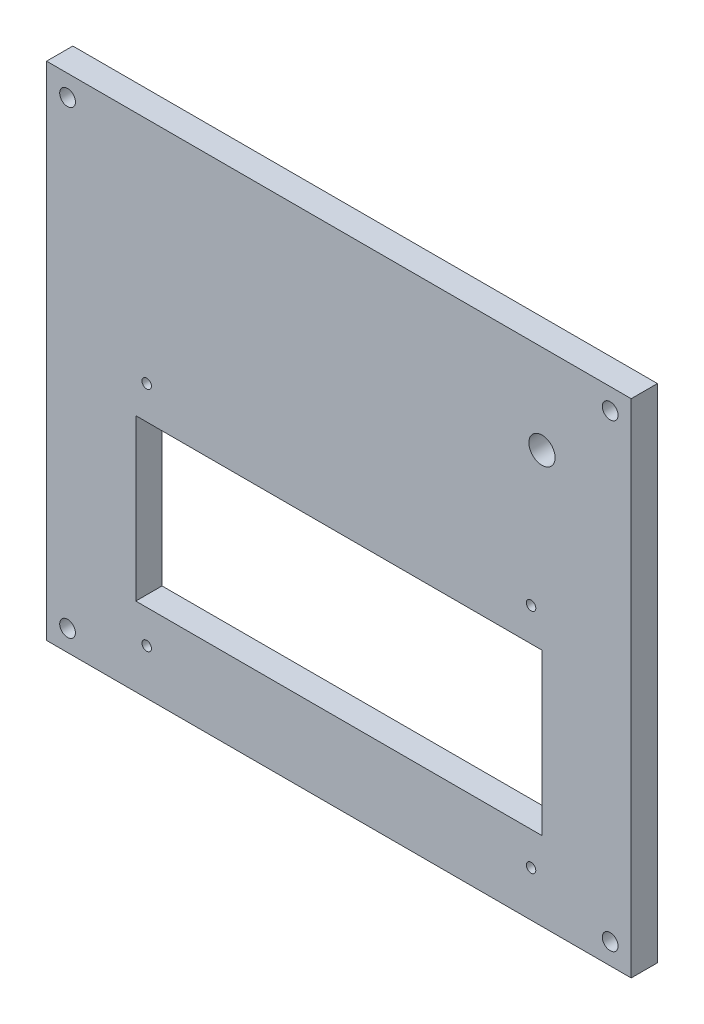
ISO-10303-21;
HEADER;
FILE_DESCRIPTION(('STEP AP214'),'2;1');
FILE_NAME('part.step','',(''),(''),'','','');
FILE_SCHEMA(('AUTOMOTIVE_DESIGN { 1 0 10303 214 1 1 1 1 }'));
ENDSEC;
DATA;
#1=APPLICATION_CONTEXT('core data for automotive mechanical design processes');
#2=APPLICATION_PROTOCOL_DEFINITION('international standard','automotive_design',2000,#1);
#3=PRODUCT_CONTEXT('',#1,'mechanical');
#4=PRODUCT('Part','Part','',(#3));
#5=PRODUCT_RELATED_PRODUCT_CATEGORY('part','',(#4));
#6=PRODUCT_DEFINITION_FORMATION('','',#4);
#7=PRODUCT_DEFINITION_CONTEXT('part definition',#1,'design');
#8=PRODUCT_DEFINITION('design','',#6,#7);
#9=PRODUCT_DEFINITION_SHAPE('','',#8);
#10=(LENGTH_UNIT() NAMED_UNIT(*) SI_UNIT(.MILLI.,.METRE.));
#11=(NAMED_UNIT(*) PLANE_ANGLE_UNIT() SI_UNIT($,.RADIAN.));
#12=(NAMED_UNIT(*) SI_UNIT($,.STERADIAN.) SOLID_ANGLE_UNIT());
#13=UNCERTAINTY_MEASURE_WITH_UNIT(LENGTH_MEASURE(1.E-05),#10,'distance_accuracy_value','');
#14=(GEOMETRIC_REPRESENTATION_CONTEXT(3) GLOBAL_UNCERTAINTY_ASSIGNED_CONTEXT((#13)) GLOBAL_UNIT_ASSIGNED_CONTEXT((#10,
#11,#12)) REPRESENTATION_CONTEXT('',''));
#15=CARTESIAN_POINT('',(0.,0.,0.));
#16=DIRECTION('',(0.,0.,1.));
#17=DIRECTION('',(1.,0.,0.));
#18=AXIS2_PLACEMENT_3D('',#15,#16,#17);
#19=CARTESIAN_POINT('',(0.,0.,6.35));
#20=DIRECTION('',(0.,0.,1.));
#21=DIRECTION('',(1.,0.,0.));
#22=AXIS2_PLACEMENT_3D('',#19,#20,#21);
#23=PLANE('',#22);
#24=CARTESIAN_POINT('',(114.808,97.282,6.35));
#25=DIRECTION('',(0.,0.,1.));
#26=DIRECTION('',(1.,0.,0.));
#27=AXIS2_PLACEMENT_3D('',#24,#25,#26);
#28=CIRCLE('',#27,1.90500000000001);
#29=CARTESIAN_POINT('',(116.713,97.282,6.35));
#30=VERTEX_POINT('',#29);
#31=EDGE_CURVE('E339',#30,#30,#28,.T.);
#32=ORIENTED_EDGE('',*,*,#31,.F.);
#33=EDGE_LOOP('',(#32));
#34=FACE_BOUND('',#33,.T.);
#35=CARTESIAN_POINT('',(114.808,-13.97,6.35));
#36=DIRECTION('',(0.,0.,1.));
#37=DIRECTION('',(1.,0.,0.));
#38=AXIS2_PLACEMENT_3D('',#35,#36,#37);
#39=CIRCLE('',#38,1.90500000000001);
#40=CARTESIAN_POINT('',(116.713,-13.97,6.35));
#41=VERTEX_POINT('',#40);
#42=EDGE_CURVE('E331',#41,#41,#39,.T.);
#43=ORIENTED_EDGE('',*,*,#42,.F.);
#44=EDGE_LOOP('',(#43));
#45=FACE_BOUND('',#44,.T.);
#46=CARTESIAN_POINT('',(-16.51,-13.97,6.35));
#47=DIRECTION('',(0.,0.,1.));
#48=DIRECTION('',(1.,0.,0.));
#49=AXIS2_PLACEMENT_3D('',#46,#47,#48);
#50=CIRCLE('',#49,1.905);
#51=CARTESIAN_POINT('',(-14.605,-13.97,6.35));
#52=VERTEX_POINT('',#51);
#53=EDGE_CURVE('E324',#52,#52,#50,.T.);
#54=ORIENTED_EDGE('',*,*,#53,.F.);
#55=EDGE_LOOP('',(#54));
#56=FACE_BOUND('',#55,.T.);
#57=CARTESIAN_POINT('',(-16.51,97.282,6.35));
#58=DIRECTION('',(0.,0.,1.));
#59=DIRECTION('',(1.,0.,0.));
#60=AXIS2_PLACEMENT_3D('',#57,#58,#59);
#61=CIRCLE('',#60,1.90500000000001);
#62=CARTESIAN_POINT('',(-14.605,97.282,6.35));
#63=VERTEX_POINT('',#62);
#64=EDGE_CURVE('E328',#63,#63,#61,.T.);
#65=ORIENTED_EDGE('',*,*,#64,.F.);
#66=EDGE_LOOP('',(#65));
#67=FACE_BOUND('',#66,.T.);
#68=CARTESIAN_POINT('',(2.6416,46.9138,6.35));
#69=DIRECTION('',(0.,0.,1.));
#70=DIRECTION('',(1.,0.,0.));
#71=AXIS2_PLACEMENT_3D('',#68,#69,#70);
#72=CIRCLE('',#71,1.143);
#73=CARTESIAN_POINT('',(3.7846,46.9138,6.35));
#74=VERTEX_POINT('',#73);
#75=EDGE_CURVE('E354',#74,#74,#72,.T.);
#76=ORIENTED_EDGE('',*,*,#75,.F.);
#77=EDGE_LOOP('',(#76));
#78=FACE_BOUND('',#77,.T.);
#79=CARTESIAN_POINT('',(95.6564,-8.0518,6.35));
#80=DIRECTION('',(0.,0.,1.));
#81=DIRECTION('',(1.,0.,0.));
#82=AXIS2_PLACEMENT_3D('',#79,#80,#81);
#83=CIRCLE('',#82,1.143);
#84=CARTESIAN_POINT('',(96.7994,-8.0518,6.35));
#85=VERTEX_POINT('',#84);
#86=EDGE_CURVE('E351',#85,#85,#83,.T.);
#87=ORIENTED_EDGE('',*,*,#86,.F.);
#88=EDGE_LOOP('',(#87));
#89=FACE_BOUND('',#88,.T.);
#90=CARTESIAN_POINT('',(2.64160000000001,-8.05179999999999,6.35));
#91=DIRECTION('',(0.,0.,1.));
#92=DIRECTION('',(1.,0.,0.));
#93=AXIS2_PLACEMENT_3D('',#90,#91,#92);
#94=CIRCLE('',#93,1.143);
#95=CARTESIAN_POINT('',(3.78460000000001,-8.05179999999999,6.35));
#96=VERTEX_POINT('',#95);
#97=EDGE_CURVE('E345',#96,#96,#94,.T.);
#98=ORIENTED_EDGE('',*,*,#97,.F.);
#99=EDGE_LOOP('',(#98));
#100=FACE_BOUND('',#99,.T.);
#101=CARTESIAN_POINT('',(95.6564,46.9138,6.35));
#102=DIRECTION('',(0.,0.,1.));
#103=DIRECTION('',(1.,0.,0.));
#104=AXIS2_PLACEMENT_3D('',#101,#102,#103);
#105=CIRCLE('',#104,1.143);
#106=CARTESIAN_POINT('',(96.7994,46.9138,6.35));
#107=VERTEX_POINT('',#106);
#108=EDGE_CURVE('E146',#107,#107,#105,.T.);
#109=ORIENTED_EDGE('',*,*,#108,.F.);
#110=EDGE_LOOP('',(#109));
#111=FACE_BOUND('',#110,.T.);
#112=DIRECTION('',(1.,0.,0.));
#113=VECTOR('',#112,1.);
#114=CARTESIAN_POINT('',(0.,0.,6.35));
#115=LINE('',#114,#113);
#116=CARTESIAN_POINT('',(0.,0.,6.35));
#117=VERTEX_POINT('',#116);
#118=CARTESIAN_POINT('',(98.298,0.,6.35));
#119=VERTEX_POINT('',#118);
#120=EDGE_CURVE('E164',#117,#119,#115,.T.);
#121=ORIENTED_EDGE('',*,*,#120,.F.);
#122=DIRECTION('',(0.,-1.,0.));
#123=VECTOR('',#122,1.);
#124=CARTESIAN_POINT('',(0.,0.,6.35));
#125=LINE('',#124,#123);
#126=CARTESIAN_POINT('',(0.,38.862,6.35));
#127=VERTEX_POINT('',#126);
#128=EDGE_CURVE('E162',#127,#117,#125,.T.);
#129=ORIENTED_EDGE('',*,*,#128,.F.);
#130=DIRECTION('',(-1.,0.,0.));
#131=VECTOR('',#130,1.);
#132=CARTESIAN_POINT('',(0.,38.862,6.35));
#133=LINE('',#132,#131);
#134=CARTESIAN_POINT('',(98.298,38.862,6.35));
#135=VERTEX_POINT('',#134);
#136=EDGE_CURVE('E169',#135,#127,#133,.T.);
#137=ORIENTED_EDGE('',*,*,#136,.F.);
#138=DIRECTION('',(0.,1.,0.));
#139=VECTOR('',#138,1.);
#140=CARTESIAN_POINT('',(98.298,0.,6.35));
#141=LINE('',#140,#139);
#142=EDGE_CURVE('E167',#119,#135,#141,.T.);
#143=ORIENTED_EDGE('',*,*,#142,.F.);
#144=EDGE_LOOP('',(#121,#129,#137,#143));
#145=FACE_BOUND('',#144,.T.);
#146=DIRECTION('',(0.,-1.,0.));
#147=VECTOR('',#146,1.);
#148=CARTESIAN_POINT('',(-21.59,102.362,6.35));
#149=LINE('',#148,#147);
#150=CARTESIAN_POINT('',(-21.59,102.362,6.35));
#151=VERTEX_POINT('',#150);
#152=CARTESIAN_POINT('',(-21.59,-19.05,6.35));
#153=VERTEX_POINT('',#152);
#154=EDGE_CURVE('E188',#151,#153,#149,.T.);
#155=ORIENTED_EDGE('',*,*,#154,.T.);
#156=DIRECTION('',(1.,0.,0.));
#157=VECTOR('',#156,1.);
#158=CARTESIAN_POINT('',(-21.59,-19.05,6.35));
#159=LINE('',#158,#157);
#160=CARTESIAN_POINT('',(119.888,-19.05,6.35));
#161=VERTEX_POINT('',#160);
#162=EDGE_CURVE('E191',#153,#161,#159,.T.);
#163=ORIENTED_EDGE('',*,*,#162,.T.);
#164=DIRECTION('',(0.,1.,0.));
#165=VECTOR('',#164,1.);
#166=CARTESIAN_POINT('',(119.888,102.362,6.35));
#167=LINE('',#166,#165);
#168=CARTESIAN_POINT('',(119.888,102.362,6.35));
#169=VERTEX_POINT('',#168);
#170=EDGE_CURVE('E194',#161,#169,#167,.T.);
#171=ORIENTED_EDGE('',*,*,#170,.T.);
#172=DIRECTION('',(-1.,0.,0.));
#173=VECTOR('',#172,1.);
#174=CARTESIAN_POINT('',(-21.59,102.362,6.35));
#175=LINE('',#174,#173);
#176=EDGE_CURVE('E196',#169,#151,#175,.T.);
#177=ORIENTED_EDGE('',*,*,#176,.T.);
#178=EDGE_LOOP('',(#155,#163,#171,#177));
#179=FACE_BOUND('',#178,.T.);
#180=CARTESIAN_POINT('',(98.298,80.772,6.35));
#181=DIRECTION('',(0.,0.,1.));
#182=DIRECTION('',(1.,0.,0.));
#183=AXIS2_PLACEMENT_3D('',#180,#181,#182);
#184=CIRCLE('',#183,3.175);
#185=CARTESIAN_POINT('',(101.473,80.772,6.35));
#186=VERTEX_POINT('',#185);
#187=EDGE_CURVE('E157',#186,#186,#184,.T.);
#188=ORIENTED_EDGE('',*,*,#187,.F.);
#189=EDGE_LOOP('',(#188));
#190=FACE_BOUND('',#189,.T.);
#191=ADVANCED_FACE('F35',(#34,#45,#56,#67,#78,#89,#100,#111,#145,#179,#190),#23,.T.);
#192=CARTESIAN_POINT('',(0.,0.,0.));
#193=DIRECTION('',(0.,0.,1.));
#194=DIRECTION('',(1.,0.,0.));
#195=AXIS2_PLACEMENT_3D('',#192,#193,#194);
#196=PLANE('',#195);
#197=CARTESIAN_POINT('',(114.808,97.282,0.));
#198=DIRECTION('',(0.,0.,1.));
#199=DIRECTION('',(1.,0.,0.));
#200=AXIS2_PLACEMENT_3D('',#197,#198,#199);
#201=CIRCLE('',#200,1.90500000000001);
#202=CARTESIAN_POINT('',(116.713,97.282,0.));
#203=VERTEX_POINT('',#202);
#204=EDGE_CURVE('E336',#203,#203,#201,.T.);
#205=ORIENTED_EDGE('',*,*,#204,.T.);
#206=EDGE_LOOP('',(#205));
#207=FACE_BOUND('',#206,.T.);
#208=CARTESIAN_POINT('',(114.808,-13.97,0.));
#209=DIRECTION('',(0.,0.,1.));
#210=DIRECTION('',(1.,0.,0.));
#211=AXIS2_PLACEMENT_3D('',#208,#209,#210);
#212=CIRCLE('',#211,1.90500000000001);
#213=CARTESIAN_POINT('',(116.713,-13.97,0.));
#214=VERTEX_POINT('',#213);
#215=EDGE_CURVE('E326',#214,#214,#212,.T.);
#216=ORIENTED_EDGE('',*,*,#215,.T.);
#217=EDGE_LOOP('',(#216));
#218=FACE_BOUND('',#217,.T.);
#219=CARTESIAN_POINT('',(-16.51,-13.97,0.));
#220=DIRECTION('',(0.,0.,1.));
#221=DIRECTION('',(1.,0.,0.));
#222=AXIS2_PLACEMENT_3D('',#219,#220,#221);
#223=CIRCLE('',#222,1.905);
#224=CARTESIAN_POINT('',(-14.605,-13.97,0.));
#225=VERTEX_POINT('',#224);
#226=EDGE_CURVE('E321',#225,#225,#223,.T.);
#227=ORIENTED_EDGE('',*,*,#226,.T.);
#228=EDGE_LOOP('',(#227));
#229=FACE_BOUND('',#228,.T.);
#230=CARTESIAN_POINT('',(-16.51,97.282,0.));
#231=DIRECTION('',(0.,0.,1.));
#232=DIRECTION('',(1.,0.,0.));
#233=AXIS2_PLACEMENT_3D('',#230,#231,#232);
#234=CIRCLE('',#233,1.90500000000001);
#235=CARTESIAN_POINT('',(-14.605,97.282,0.));
#236=VERTEX_POINT('',#235);
#237=EDGE_CURVE('E342',#236,#236,#234,.T.);
#238=ORIENTED_EDGE('',*,*,#237,.T.);
#239=EDGE_LOOP('',(#238));
#240=FACE_BOUND('',#239,.T.);
#241=CARTESIAN_POINT('',(95.6564,-8.0518,0.));
#242=DIRECTION('',(0.,0.,1.));
#243=DIRECTION('',(1.,0.,0.));
#244=AXIS2_PLACEMENT_3D('',#241,#242,#243);
#245=CIRCLE('',#244,1.143);
#246=CARTESIAN_POINT('',(96.7994,-8.0518,0.));
#247=VERTEX_POINT('',#246);
#248=EDGE_CURVE('E357',#247,#247,#245,.T.);
#249=ORIENTED_EDGE('',*,*,#248,.T.);
#250=EDGE_LOOP('',(#249));
#251=FACE_BOUND('',#250,.T.);
#252=CARTESIAN_POINT('',(2.64160000000001,-8.05179999999999,0.));
#253=DIRECTION('',(0.,0.,1.));
#254=DIRECTION('',(1.,0.,0.));
#255=AXIS2_PLACEMENT_3D('',#252,#253,#254);
#256=CIRCLE('',#255,1.143);
#257=CARTESIAN_POINT('',(3.78460000000001,-8.05179999999999,0.));
#258=VERTEX_POINT('',#257);
#259=EDGE_CURVE('E348',#258,#258,#256,.T.);
#260=ORIENTED_EDGE('',*,*,#259,.T.);
#261=EDGE_LOOP('',(#260));
#262=FACE_BOUND('',#261,.T.);
#263=CARTESIAN_POINT('',(95.6564,46.9138,0.));
#264=DIRECTION('',(0.,0.,1.));
#265=DIRECTION('',(1.,0.,0.));
#266=AXIS2_PLACEMENT_3D('',#263,#264,#265);
#267=CIRCLE('',#266,1.143);
#268=CARTESIAN_POINT('',(96.7994,46.9138,0.));
#269=VERTEX_POINT('',#268);
#270=EDGE_CURVE('E361',#269,#269,#267,.T.);
#271=ORIENTED_EDGE('',*,*,#270,.T.);
#272=EDGE_LOOP('',(#271));
#273=FACE_BOUND('',#272,.T.);
#274=DIRECTION('',(0.,-1.,0.));
#275=VECTOR('',#274,1.);
#276=CARTESIAN_POINT('',(-21.59,102.362,0.));
#277=LINE('',#276,#275);
#278=CARTESIAN_POINT('',(-21.59,102.362,0.));
#279=VERTEX_POINT('',#278);
#280=CARTESIAN_POINT('',(-21.59,-19.05,0.));
#281=VERTEX_POINT('',#280);
#282=EDGE_CURVE('E187',#279,#281,#277,.T.);
#283=ORIENTED_EDGE('',*,*,#282,.F.);
#284=DIRECTION('',(-1.,0.,0.));
#285=VECTOR('',#284,1.);
#286=CARTESIAN_POINT('',(-21.59,102.362,0.));
#287=LINE('',#286,#285);
#288=CARTESIAN_POINT('',(119.888,102.362,0.));
#289=VERTEX_POINT('',#288);
#290=EDGE_CURVE('E192',#289,#279,#287,.T.);
#291=ORIENTED_EDGE('',*,*,#290,.F.);
#292=DIRECTION('',(0.,1.,0.));
#293=VECTOR('',#292,1.);
#294=CARTESIAN_POINT('',(119.888,102.362,0.));
#295=LINE('',#294,#293);
#296=CARTESIAN_POINT('',(119.888,-19.05,0.));
#297=VERTEX_POINT('',#296);
#298=EDGE_CURVE('E203',#297,#289,#295,.T.);
#299=ORIENTED_EDGE('',*,*,#298,.F.);
#300=DIRECTION('',(1.,0.,0.));
#301=VECTOR('',#300,1.);
#302=CARTESIAN_POINT('',(-21.59,-19.05,0.));
#303=LINE('',#302,#301);
#304=EDGE_CURVE('E201',#281,#297,#303,.T.);
#305=ORIENTED_EDGE('',*,*,#304,.F.);
#306=EDGE_LOOP('',(#283,#291,#299,#305));
#307=FACE_BOUND('',#306,.T.);
#308=DIRECTION('',(1.,0.,0.));
#309=VECTOR('',#308,1.);
#310=CARTESIAN_POINT('',(0.,74.422,0.));
#311=LINE('',#310,#309);
#312=CARTESIAN_POINT('',(0.,74.422,0.));
#313=VERTEX_POINT('',#312);
#314=CARTESIAN_POINT('',(61.47357821125,74.422,0.));
#315=VERTEX_POINT('',#314);
#316=EDGE_CURVE('E143',#313,#315,#311,.T.);
#317=ORIENTED_EDGE('',*,*,#316,.F.);
#318=DIRECTION('',(0.,-1.,0.));
#319=VECTOR('',#318,1.);
#320=CARTESIAN_POINT('',(0.,0.,0.));
#321=LINE('',#320,#319);
#322=CARTESIAN_POINT('',(0.,0.,0.));
#323=VERTEX_POINT('',#322);
#324=EDGE_CURVE('E128',#313,#323,#321,.T.);
#325=ORIENTED_EDGE('',*,*,#324,.T.);
#326=DIRECTION('',(1.,0.,0.));
#327=VECTOR('',#326,1.);
#328=CARTESIAN_POINT('',(0.,0.,0.));
#329=LINE('',#328,#327);
#330=CARTESIAN_POINT('',(98.298,0.,0.));
#331=VERTEX_POINT('',#330);
#332=EDGE_CURVE('E173',#323,#331,#329,.T.);
#333=ORIENTED_EDGE('',*,*,#332,.T.);
#334=DIRECTION('',(0.,1.,0.));
#335=VECTOR('',#334,1.);
#336=CARTESIAN_POINT('',(98.298,0.,0.));
#337=LINE('',#336,#335);
#338=CARTESIAN_POINT('',(98.298,38.862,0.));
#339=VERTEX_POINT('',#338);
#340=EDGE_CURVE('E176',#331,#339,#337,.T.);
#341=ORIENTED_EDGE('',*,*,#340,.T.);
#342=DIRECTION('',(-1.,0.,0.));
#343=VECTOR('',#342,1.);
#344=CARTESIAN_POINT('',(0.,38.862,0.));
#345=LINE('',#344,#343);
#346=CARTESIAN_POINT('',(61.47357821125,38.862,0.));
#347=VERTEX_POINT('',#346);
#348=EDGE_CURVE('E165',#339,#347,#345,.T.);
#349=ORIENTED_EDGE('',*,*,#348,.T.);
#350=DIRECTION('',(0.,-1.,0.));
#351=VECTOR('',#350,1.);
#352=CARTESIAN_POINT('',(61.47357821125,38.862,0.));
#353=LINE('',#352,#351);
#354=EDGE_CURVE('E141',#315,#347,#353,.T.);
#355=ORIENTED_EDGE('',*,*,#354,.F.);
#356=EDGE_LOOP('',(#317,#325,#333,#341,#349,#355));
#357=FACE_BOUND('',#356,.T.);
#358=CARTESIAN_POINT('',(98.298,80.772,0.));
#359=DIRECTION('',(0.,0.,1.));
#360=DIRECTION('',(1.,0.,0.));
#361=AXIS2_PLACEMENT_3D('',#358,#359,#360);
#362=CIRCLE('',#361,3.175);
#363=CARTESIAN_POINT('',(101.473,80.772,0.));
#364=VERTEX_POINT('',#363);
#365=EDGE_CURVE('E155',#364,#364,#362,.T.);
#366=ORIENTED_EDGE('',*,*,#365,.T.);
#367=EDGE_LOOP('',(#366));
#368=FACE_BOUND('',#367,.T.);
#369=ADVANCED_FACE('F222',(#207,#218,#229,#240,#251,#262,#273,#307,#357,#368),#196,.F.);
#370=CARTESIAN_POINT('',(-21.59,102.362,6.35));
#371=DIRECTION('',(1.,0.,0.));
#372=DIRECTION('',(0.,1.,0.));
#373=AXIS2_PLACEMENT_3D('',#370,#371,#372);
#374=PLANE('',#373);
#375=ORIENTED_EDGE('',*,*,#282,.T.);
#376=DIRECTION('',(0.,0.,-1.));
#377=VECTOR('',#376,1.);
#378=CARTESIAN_POINT('',(-21.59,-19.05,6.35));
#379=LINE('',#378,#377);
#380=EDGE_CURVE('E11',#153,#281,#379,.T.);
#381=ORIENTED_EDGE('',*,*,#380,.F.);
#382=ORIENTED_EDGE('',*,*,#154,.F.);
#383=DIRECTION('',(0.,0.,-1.));
#384=VECTOR('',#383,1.);
#385=CARTESIAN_POINT('',(-21.59,102.362,6.35));
#386=LINE('',#385,#384);
#387=EDGE_CURVE('E198',#151,#279,#386,.T.);
#388=ORIENTED_EDGE('',*,*,#387,.T.);
#389=EDGE_LOOP('',(#375,#381,#382,#388));
#390=FACE_BOUND('',#389,.T.);
#391=ADVANCED_FACE('F37',(#390),#374,.F.);
#392=CARTESIAN_POINT('',(-21.59,-19.05,6.35));
#393=DIRECTION('',(0.,1.,0.));
#394=DIRECTION('',(0.,0.,1.));
#395=AXIS2_PLACEMENT_3D('',#392,#393,#394);
#396=PLANE('',#395);
#397=ORIENTED_EDGE('',*,*,#304,.T.);
#398=DIRECTION('',(0.,0.,-1.));
#399=VECTOR('',#398,1.);
#400=CARTESIAN_POINT('',(119.888,-19.05,6.35));
#401=LINE('',#400,#399);
#402=EDGE_CURVE('E44',#161,#297,#401,.T.);
#403=ORIENTED_EDGE('',*,*,#402,.F.);
#404=ORIENTED_EDGE('',*,*,#162,.F.);
#405=ORIENTED_EDGE('',*,*,#380,.T.);
#406=EDGE_LOOP('',(#397,#403,#404,#405));
#407=FACE_BOUND('',#406,.T.);
#408=ADVANCED_FACE('F233',(#407),#396,.F.);
#409=CARTESIAN_POINT('',(119.888,102.362,6.35));
#410=DIRECTION('',(-1.,0.,0.));
#411=DIRECTION('',(0.,-1.,0.));
#412=AXIS2_PLACEMENT_3D('',#409,#410,#411);
#413=PLANE('',#412);
#414=ORIENTED_EDGE('',*,*,#298,.T.);
#415=DIRECTION('',(0.,0.,-1.));
#416=VECTOR('',#415,1.);
#417=CARTESIAN_POINT('',(119.888,102.362,6.35));
#418=LINE('',#417,#416);
#419=EDGE_CURVE('E208',#169,#289,#418,.T.);
#420=ORIENTED_EDGE('',*,*,#419,.F.);
#421=ORIENTED_EDGE('',*,*,#170,.F.);
#422=ORIENTED_EDGE('',*,*,#402,.T.);
#423=EDGE_LOOP('',(#414,#420,#421,#422));
#424=FACE_BOUND('',#423,.T.);
#425=ADVANCED_FACE('F216',(#424),#413,.F.);
#426=CARTESIAN_POINT('',(-21.59,102.362,6.35));
#427=DIRECTION('',(0.,-1.,0.));
#428=DIRECTION('',(0.,0.,-1.));
#429=AXIS2_PLACEMENT_3D('',#426,#427,#428);
#430=PLANE('',#429);
#431=ORIENTED_EDGE('',*,*,#290,.T.);
#432=ORIENTED_EDGE('',*,*,#387,.F.);
#433=ORIENTED_EDGE('',*,*,#176,.F.);
#434=ORIENTED_EDGE('',*,*,#419,.T.);
#435=EDGE_LOOP('',(#431,#432,#433,#434));
#436=FACE_BOUND('',#435,.T.);
#437=ADVANCED_FACE('F226',(#436),#430,.F.);
#438=CARTESIAN_POINT('',(0.,0.,6.35));
#439=DIRECTION('',(1.,0.,0.));
#440=DIRECTION('',(0.,0.,-1.));
#441=AXIS2_PLACEMENT_3D('',#438,#439,#440);
#442=PLANE('',#441);
#443=ORIENTED_EDGE('',*,*,#324,.F.);
#444=DIRECTION('',(0.,0.,-1.));
#445=VECTOR('',#444,1.);
#446=CARTESIAN_POINT('',(0.,74.422,3.81));
#447=LINE('',#446,#445);
#448=CARTESIAN_POINT('',(0.,74.422,3.81));
#449=VERTEX_POINT('',#448);
#450=EDGE_CURVE('E120',#449,#313,#447,.T.);
#451=ORIENTED_EDGE('',*,*,#450,.F.);
#452=DIRECTION('',(0.,1.,0.));
#453=VECTOR('',#452,1.);
#454=CARTESIAN_POINT('',(0.,38.862,3.81));
#455=LINE('',#454,#453);
#456=CARTESIAN_POINT('',(0.,38.862,3.81));
#457=VERTEX_POINT('',#456);
#458=EDGE_CURVE('E125',#457,#449,#455,.T.);
#459=ORIENTED_EDGE('',*,*,#458,.F.);
#460=DIRECTION('',(0.,0.,-1.));
#461=VECTOR('',#460,1.);
#462=CARTESIAN_POINT('',(0.,38.862,6.35));
#463=LINE('',#462,#461);
#464=EDGE_CURVE('E171',#127,#457,#463,.T.);
#465=ORIENTED_EDGE('',*,*,#464,.F.);
#466=ORIENTED_EDGE('',*,*,#128,.T.);
#467=DIRECTION('',(0.,0.,-1.));
#468=VECTOR('',#467,1.);
#469=CARTESIAN_POINT('',(0.,0.,6.35));
#470=LINE('',#469,#468);
#471=EDGE_CURVE('E185',#117,#323,#470,.T.);
#472=ORIENTED_EDGE('',*,*,#471,.T.);
#473=EDGE_LOOP('',(#443,#451,#459,#465,#466,#472));
#474=FACE_BOUND('',#473,.T.);
#475=ADVANCED_FACE('F122',(#474),#442,.T.);
#476=CARTESIAN_POINT('',(0.,0.,6.35));
#477=DIRECTION('',(0.,1.,0.));
#478=DIRECTION('',(0.,0.,1.));
#479=AXIS2_PLACEMENT_3D('',#476,#477,#478);
#480=PLANE('',#479);
#481=ORIENTED_EDGE('',*,*,#332,.F.);
#482=ORIENTED_EDGE('',*,*,#471,.F.);
#483=ORIENTED_EDGE('',*,*,#120,.T.);
#484=DIRECTION('',(0.,0.,-1.));
#485=VECTOR('',#484,1.);
#486=CARTESIAN_POINT('',(98.298,0.,6.35));
#487=LINE('',#486,#485);
#488=EDGE_CURVE('E183',#119,#331,#487,.T.);
#489=ORIENTED_EDGE('',*,*,#488,.T.);
#490=EDGE_LOOP('',(#481,#482,#483,#489));
#491=FACE_BOUND('',#490,.T.);
#492=ADVANCED_FACE('F257',(#491),#480,.T.);
#493=CARTESIAN_POINT('',(98.298,0.,6.35));
#494=DIRECTION('',(-1.,0.,0.));
#495=DIRECTION('',(0.,0.,1.));
#496=AXIS2_PLACEMENT_3D('',#493,#494,#495);
#497=PLANE('',#496);
#498=ORIENTED_EDGE('',*,*,#340,.F.);
#499=ORIENTED_EDGE('',*,*,#488,.F.);
#500=ORIENTED_EDGE('',*,*,#142,.T.);
#501=DIRECTION('',(0.,0.,-1.));
#502=VECTOR('',#501,1.);
#503=CARTESIAN_POINT('',(98.298,38.862,6.35));
#504=LINE('',#503,#502);
#505=EDGE_CURVE('E59',#135,#339,#504,.T.);
#506=ORIENTED_EDGE('',*,*,#505,.T.);
#507=EDGE_LOOP('',(#498,#499,#500,#506));
#508=FACE_BOUND('',#507,.T.);
#509=ADVANCED_FACE('F261',(#508),#497,.T.);
#510=CARTESIAN_POINT('',(0.,38.862,6.35));
#511=DIRECTION('',(0.,-1.,0.));
#512=DIRECTION('',(0.,0.,-1.));
#513=AXIS2_PLACEMENT_3D('',#510,#511,#512);
#514=PLANE('',#513);
#515=DIRECTION('',(0.,0.,-1.));
#516=VECTOR('',#515,1.);
#517=CARTESIAN_POINT('',(61.47357821125,38.862,3.81));
#518=LINE('',#517,#516);
#519=CARTESIAN_POINT('',(61.47357821125,38.862,3.81));
#520=VERTEX_POINT('',#519);
#521=EDGE_CURVE('E152',#520,#347,#518,.T.);
#522=ORIENTED_EDGE('',*,*,#521,.T.);
#523=ORIENTED_EDGE('',*,*,#348,.F.);
#524=ORIENTED_EDGE('',*,*,#505,.F.);
#525=ORIENTED_EDGE('',*,*,#136,.T.);
#526=ORIENTED_EDGE('',*,*,#464,.T.);
#527=DIRECTION('',(-1.,0.,0.));
#528=VECTOR('',#527,1.);
#529=CARTESIAN_POINT('',(0.,38.862,3.81));
#530=LINE('',#529,#528);
#531=EDGE_CURVE('E133',#520,#457,#530,.T.);
#532=ORIENTED_EDGE('',*,*,#531,.F.);
#533=EDGE_LOOP('',(#522,#523,#524,#525,#526,#532));
#534=FACE_BOUND('',#533,.T.);
#535=ADVANCED_FACE('F266',(#534),#514,.T.);
#536=CARTESIAN_POINT('',(98.298,80.772,6.35));
#537=DIRECTION('',(0.,0.,-1.));
#538=DIRECTION('',(-1.,0.,0.));
#539=AXIS2_PLACEMENT_3D('',#536,#537,#538);
#540=CYLINDRICAL_SURFACE('',#539,3.175);
#541=ORIENTED_EDGE('',*,*,#187,.T.);
#542=EDGE_LOOP('',(#541));
#543=FACE_BOUND('',#542,.T.);
#544=ORIENTED_EDGE('',*,*,#365,.F.);
#545=EDGE_LOOP('',(#544));
#546=FACE_BOUND('',#545,.T.);
#547=ADVANCED_FACE('F272',(#543,#546),#540,.F.);
#548=CARTESIAN_POINT('',(61.47357821125,38.862,3.81));
#549=DIRECTION('',(1.,0.,0.));
#550=DIRECTION('',(0.,0.,-1.));
#551=AXIS2_PLACEMENT_3D('',#548,#549,#550);
#552=PLANE('',#551);
#553=ORIENTED_EDGE('',*,*,#354,.T.);
#554=ORIENTED_EDGE('',*,*,#521,.F.);
#555=DIRECTION('',(0.,-1.,0.));
#556=VECTOR('',#555,1.);
#557=CARTESIAN_POINT('',(61.47357821125,38.862,3.81));
#558=LINE('',#557,#556);
#559=CARTESIAN_POINT('',(61.47357821125,74.422,3.81));
#560=VERTEX_POINT('',#559);
#561=EDGE_CURVE('E51',#560,#520,#558,.T.);
#562=ORIENTED_EDGE('',*,*,#561,.F.);
#563=DIRECTION('',(0.,0.,-1.));
#564=VECTOR('',#563,1.);
#565=CARTESIAN_POINT('',(61.47357821125,74.422,3.81));
#566=LINE('',#565,#564);
#567=EDGE_CURVE('E132',#560,#315,#566,.T.);
#568=ORIENTED_EDGE('',*,*,#567,.T.);
#569=EDGE_LOOP('',(#553,#554,#562,#568));
#570=FACE_BOUND('',#569,.T.);
#571=ADVANCED_FACE('F275',(#570),#552,.F.);
#572=CARTESIAN_POINT('',(0.,74.422,3.81));
#573=DIRECTION('',(0.,1.,0.));
#574=DIRECTION('',(0.,0.,1.));
#575=AXIS2_PLACEMENT_3D('',#572,#573,#574);
#576=PLANE('',#575);
#577=ORIENTED_EDGE('',*,*,#316,.T.);
#578=ORIENTED_EDGE('',*,*,#567,.F.);
#579=DIRECTION('',(1.,0.,0.));
#580=VECTOR('',#579,1.);
#581=CARTESIAN_POINT('',(0.,74.422,3.81));
#582=LINE('',#581,#580);
#583=EDGE_CURVE('E135',#449,#560,#582,.T.);
#584=ORIENTED_EDGE('',*,*,#583,.F.);
#585=ORIENTED_EDGE('',*,*,#450,.T.);
#586=EDGE_LOOP('',(#577,#578,#584,#585));
#587=FACE_BOUND('',#586,.T.);
#588=ADVANCED_FACE('F136',(#587),#576,.F.);
#589=CARTESIAN_POINT('',(0.,0.,3.81));
#590=DIRECTION('',(0.,0.,-1.));
#591=DIRECTION('',(-1.,0.,0.));
#592=AXIS2_PLACEMENT_3D('',#589,#590,#591);
#593=PLANE('',#592);
#594=CARTESIAN_POINT('',(2.6416,46.9138,3.81));
#595=DIRECTION('',(0.,0.,-1.));
#596=DIRECTION('',(-1.,0.,0.));
#597=AXIS2_PLACEMENT_3D('',#594,#595,#596);
#598=CIRCLE('',#597,1.143);
#599=CARTESIAN_POINT('',(1.4986,46.9138,3.81));
#600=VERTEX_POINT('',#599);
#601=EDGE_CURVE('E39',#600,#600,#598,.T.);
#602=ORIENTED_EDGE('',*,*,#601,.F.);
#603=EDGE_LOOP('',(#602));
#604=FACE_BOUND('',#603,.T.);
#605=ORIENTED_EDGE('',*,*,#458,.T.);
#606=ORIENTED_EDGE('',*,*,#583,.T.);
#607=ORIENTED_EDGE('',*,*,#561,.T.);
#608=ORIENTED_EDGE('',*,*,#531,.T.);
#609=EDGE_LOOP('',(#605,#606,#607,#608));
#610=FACE_BOUND('',#609,.T.);
#611=ADVANCED_FACE('F138',(#604,#610),#593,.T.);
#612=CARTESIAN_POINT('',(2.6416,46.9138,0.));
#613=DIRECTION('',(0.,0.,1.));
#614=DIRECTION('',(1.,0.,0.));
#615=AXIS2_PLACEMENT_3D('',#612,#613,#614);
#616=CYLINDRICAL_SURFACE('',#615,1.143);
#617=ORIENTED_EDGE('',*,*,#601,.T.);
#618=EDGE_LOOP('',(#617));
#619=FACE_BOUND('',#618,.T.);
#620=ORIENTED_EDGE('',*,*,#75,.T.);
#621=EDGE_LOOP('',(#620));
#622=FACE_BOUND('',#621,.T.);
#623=ADVANCED_FACE('F284',(#619,#622),#616,.F.);
#624=CARTESIAN_POINT('',(95.6564,46.9138,0.));
#625=DIRECTION('',(0.,0.,1.));
#626=DIRECTION('',(1.,0.,0.));
#627=AXIS2_PLACEMENT_3D('',#624,#625,#626);
#628=CYLINDRICAL_SURFACE('',#627,1.143);
#629=ORIENTED_EDGE('',*,*,#270,.F.);
#630=EDGE_LOOP('',(#629));
#631=FACE_BOUND('',#630,.T.);
#632=ORIENTED_EDGE('',*,*,#108,.T.);
#633=EDGE_LOOP('',(#632));
#634=FACE_BOUND('',#633,.T.);
#635=ADVANCED_FACE('F286',(#631,#634),#628,.F.);
#636=CARTESIAN_POINT('',(2.64160000000001,-8.05179999999999,0.));
#637=DIRECTION('',(0.,0.,1.));
#638=DIRECTION('',(1.,0.,0.));
#639=AXIS2_PLACEMENT_3D('',#636,#637,#638);
#640=CYLINDRICAL_SURFACE('',#639,1.143);
#641=ORIENTED_EDGE('',*,*,#259,.F.);
#642=EDGE_LOOP('',(#641));
#643=FACE_BOUND('',#642,.T.);
#644=ORIENTED_EDGE('',*,*,#97,.T.);
#645=EDGE_LOOP('',(#644));
#646=FACE_BOUND('',#645,.T.);
#647=ADVANCED_FACE('F289',(#643,#646),#640,.F.);
#648=CARTESIAN_POINT('',(95.6564,-8.0518,0.));
#649=DIRECTION('',(0.,0.,1.));
#650=DIRECTION('',(1.,0.,0.));
#651=AXIS2_PLACEMENT_3D('',#648,#649,#650);
#652=CYLINDRICAL_SURFACE('',#651,1.143);
#653=ORIENTED_EDGE('',*,*,#248,.F.);
#654=EDGE_LOOP('',(#653));
#655=FACE_BOUND('',#654,.T.);
#656=ORIENTED_EDGE('',*,*,#86,.T.);
#657=EDGE_LOOP('',(#656));
#658=FACE_BOUND('',#657,.T.);
#659=ADVANCED_FACE('F291',(#655,#658),#652,.F.);
#660=CARTESIAN_POINT('',(-16.51,97.282,0.));
#661=DIRECTION('',(0.,0.,1.));
#662=DIRECTION('',(1.,0.,0.));
#663=AXIS2_PLACEMENT_3D('',#660,#661,#662);
#664=CYLINDRICAL_SURFACE('',#663,1.90500000000001);
#665=ORIENTED_EDGE('',*,*,#237,.F.);
#666=EDGE_LOOP('',(#665));
#667=FACE_BOUND('',#666,.T.);
#668=ORIENTED_EDGE('',*,*,#64,.T.);
#669=EDGE_LOOP('',(#668));
#670=FACE_BOUND('',#669,.T.);
#671=ADVANCED_FACE('F294',(#667,#670),#664,.F.);
#672=CARTESIAN_POINT('',(-16.51,-13.97,0.));
#673=DIRECTION('',(0.,0.,1.));
#674=DIRECTION('',(1.,0.,0.));
#675=AXIS2_PLACEMENT_3D('',#672,#673,#674);
#676=CYLINDRICAL_SURFACE('',#675,1.905);
#677=ORIENTED_EDGE('',*,*,#226,.F.);
#678=EDGE_LOOP('',(#677));
#679=FACE_BOUND('',#678,.T.);
#680=ORIENTED_EDGE('',*,*,#53,.T.);
#681=EDGE_LOOP('',(#680));
#682=FACE_BOUND('',#681,.T.);
#683=ADVANCED_FACE('F304',(#679,#682),#676,.F.);
#684=CARTESIAN_POINT('',(114.808,-13.97,0.));
#685=DIRECTION('',(0.,0.,1.));
#686=DIRECTION('',(1.,0.,0.));
#687=AXIS2_PLACEMENT_3D('',#684,#685,#686);
#688=CYLINDRICAL_SURFACE('',#687,1.90500000000001);
#689=ORIENTED_EDGE('',*,*,#215,.F.);
#690=EDGE_LOOP('',(#689));
#691=FACE_BOUND('',#690,.T.);
#692=ORIENTED_EDGE('',*,*,#42,.T.);
#693=EDGE_LOOP('',(#692));
#694=FACE_BOUND('',#693,.T.);
#695=ADVANCED_FACE('F309',(#691,#694),#688,.F.);
#696=CARTESIAN_POINT('',(114.808,97.282,0.));
#697=DIRECTION('',(0.,0.,1.));
#698=DIRECTION('',(1.,0.,0.));
#699=AXIS2_PLACEMENT_3D('',#696,#697,#698);
#700=CYLINDRICAL_SURFACE('',#699,1.90500000000001);
#701=ORIENTED_EDGE('',*,*,#204,.F.);
#702=EDGE_LOOP('',(#701));
#703=FACE_BOUND('',#702,.T.);
#704=ORIENTED_EDGE('',*,*,#31,.T.);
#705=EDGE_LOOP('',(#704));
#706=FACE_BOUND('',#705,.T.);
#707=ADVANCED_FACE('F306',(#703,#706),#700,.F.);
#708=CLOSED_SHELL('',(#191,#369,#391,#408,#425,#437,#475,#492,#509,#535,#547,#571,#588,#611,
#623,#635,#647,#659,#671,#683,#695,#707));
#709=MANIFOLD_SOLID_BREP('B2',#708);
#710=ADVANCED_BREP_SHAPE_REPRESENTATION('',(#18,#709),#14);
#711=SHAPE_DEFINITION_REPRESENTATION(#9,#710);
ENDSEC;
END-ISO-10303-21;
